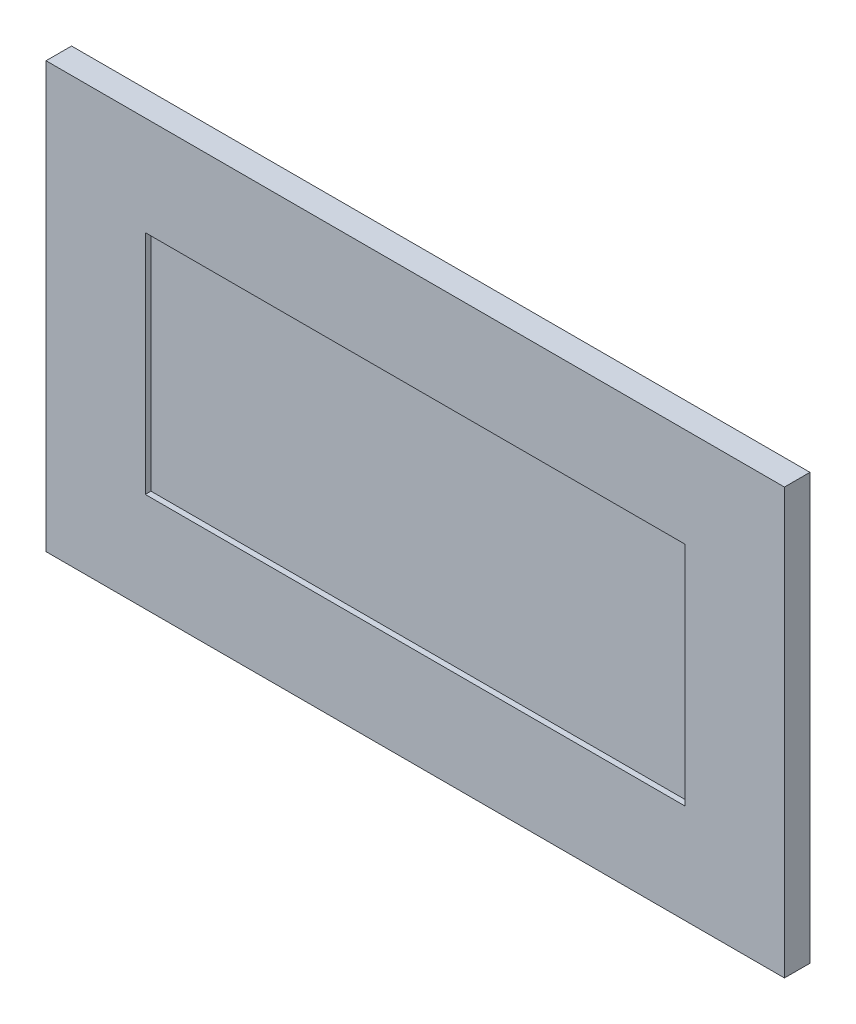
ISO-10303-21;
HEADER;
FILE_DESCRIPTION(('STEP AP214'),'2;1');
FILE_NAME('part.step','',(''),(''),'','','');
FILE_SCHEMA(('AUTOMOTIVE_DESIGN { 1 0 10303 214 1 1 1 1 }'));
ENDSEC;
DATA;
#1=APPLICATION_CONTEXT('core data for automotive mechanical design processes');
#2=APPLICATION_PROTOCOL_DEFINITION('international standard','automotive_design',2000,#1);
#3=PRODUCT_CONTEXT('',#1,'mechanical');
#4=PRODUCT('Part','Part','',(#3));
#5=PRODUCT_RELATED_PRODUCT_CATEGORY('part','',(#4));
#6=PRODUCT_DEFINITION_FORMATION('','',#4);
#7=PRODUCT_DEFINITION_CONTEXT('part definition',#1,'design');
#8=PRODUCT_DEFINITION('design','',#6,#7);
#9=PRODUCT_DEFINITION_SHAPE('','',#8);
#10=(LENGTH_UNIT() NAMED_UNIT(*) SI_UNIT(.MILLI.,.METRE.));
#11=(NAMED_UNIT(*) PLANE_ANGLE_UNIT() SI_UNIT($,.RADIAN.));
#12=(NAMED_UNIT(*) SI_UNIT($,.STERADIAN.) SOLID_ANGLE_UNIT());
#13=UNCERTAINTY_MEASURE_WITH_UNIT(LENGTH_MEASURE(1.E-05),#10,'distance_accuracy_value','');
#14=(GEOMETRIC_REPRESENTATION_CONTEXT(3) GLOBAL_UNCERTAINTY_ASSIGNED_CONTEXT((#13)) GLOBAL_UNIT_ASSIGNED_CONTEXT((#10,
#11,#12)) REPRESENTATION_CONTEXT('',''));
#15=CARTESIAN_POINT('',(0.,0.,0.));
#16=DIRECTION('',(0.,0.,1.));
#17=DIRECTION('',(1.,0.,0.));
#18=AXIS2_PLACEMENT_3D('',#15,#16,#17);
#19=CARTESIAN_POINT('',(260.5,150.,18.));
#20=DIRECTION('',(-1.,0.,0.));
#21=DIRECTION('',(0.,-1.,0.));
#22=AXIS2_PLACEMENT_3D('',#19,#20,#21);
#23=PLANE('',#22);
#24=DIRECTION('',(0.,1.,0.));
#25=VECTOR('',#24,1.);
#26=CARTESIAN_POINT('',(260.5,150.,0.));
#27=LINE('',#26,#25);
#28=CARTESIAN_POINT('',(260.5,-150.,0.));
#29=VERTEX_POINT('',#28);
#30=CARTESIAN_POINT('',(260.5,150.,0.));
#31=VERTEX_POINT('',#30);
#32=EDGE_CURVE('E141',#29,#31,#27,.T.);
#33=ORIENTED_EDGE('',*,*,#32,.T.);
#34=DIRECTION('',(0.,0.,-1.));
#35=VECTOR('',#34,1.);
#36=CARTESIAN_POINT('',(260.5,150.,18.));
#37=LINE('',#36,#35);
#38=CARTESIAN_POINT('',(260.5,150.,18.));
#39=VERTEX_POINT('',#38);
#40=EDGE_CURVE('E11',#39,#31,#37,.T.);
#41=ORIENTED_EDGE('',*,*,#40,.F.);
#42=DIRECTION('',(0.,1.,0.));
#43=VECTOR('',#42,1.);
#44=CARTESIAN_POINT('',(260.5,150.,18.));
#45=LINE('',#44,#43);
#46=CARTESIAN_POINT('',(260.5,-150.,18.));
#47=VERTEX_POINT('',#46);
#48=EDGE_CURVE('E145',#47,#39,#45,.T.);
#49=ORIENTED_EDGE('',*,*,#48,.F.);
#50=DIRECTION('',(0.,0.,-1.));
#51=VECTOR('',#50,1.);
#52=CARTESIAN_POINT('',(260.5,-150.,18.));
#53=LINE('',#52,#51);
#54=EDGE_CURVE('E151',#47,#29,#53,.T.);
#55=ORIENTED_EDGE('',*,*,#54,.T.);
#56=EDGE_LOOP('',(#33,#41,#49,#55));
#57=FACE_BOUND('',#56,.T.);
#58=ADVANCED_FACE('F33',(#57),#23,.F.);
#59=CARTESIAN_POINT('',(-260.5,150.,18.));
#60=DIRECTION('',(0.,-1.,0.));
#61=DIRECTION('',(0.,0.,-1.));
#62=AXIS2_PLACEMENT_3D('',#59,#60,#61);
#63=PLANE('',#62);
#64=DIRECTION('',(-1.,0.,0.));
#65=VECTOR('',#64,1.);
#66=CARTESIAN_POINT('',(-260.5,150.,0.));
#67=LINE('',#66,#65);
#68=CARTESIAN_POINT('',(-260.5,150.,0.));
#69=VERTEX_POINT('',#68);
#70=EDGE_CURVE('E154',#31,#69,#67,.T.);
#71=ORIENTED_EDGE('',*,*,#70,.T.);
#72=DIRECTION('',(0.,0.,-1.));
#73=VECTOR('',#72,1.);
#74=CARTESIAN_POINT('',(-260.5,150.,18.));
#75=LINE('',#74,#73);
#76=CARTESIAN_POINT('',(-260.5,150.,18.));
#77=VERTEX_POINT('',#76);
#78=EDGE_CURVE('E40',#77,#69,#75,.T.);
#79=ORIENTED_EDGE('',*,*,#78,.F.);
#80=DIRECTION('',(-1.,0.,0.));
#81=VECTOR('',#80,1.);
#82=CARTESIAN_POINT('',(-260.5,150.,18.));
#83=LINE('',#82,#81);
#84=EDGE_CURVE('E84',#39,#77,#83,.T.);
#85=ORIENTED_EDGE('',*,*,#84,.F.);
#86=ORIENTED_EDGE('',*,*,#40,.T.);
#87=EDGE_LOOP('',(#71,#79,#85,#86));
#88=FACE_BOUND('',#87,.T.);
#89=ADVANCED_FACE('F183',(#88),#63,.F.);
#90=CARTESIAN_POINT('',(-260.5,150.,18.));
#91=DIRECTION('',(1.,0.,0.));
#92=DIRECTION('',(0.,1.,0.));
#93=AXIS2_PLACEMENT_3D('',#90,#91,#92);
#94=PLANE('',#93);
#95=DIRECTION('',(0.,-1.,0.));
#96=VECTOR('',#95,1.);
#97=CARTESIAN_POINT('',(-260.5,150.,0.));
#98=LINE('',#97,#96);
#99=CARTESIAN_POINT('',(-260.5,-150.,0.));
#100=VERTEX_POINT('',#99);
#101=EDGE_CURVE('E156',#69,#100,#98,.T.);
#102=ORIENTED_EDGE('',*,*,#101,.T.);
#103=DIRECTION('',(0.,0.,-1.));
#104=VECTOR('',#103,1.);
#105=CARTESIAN_POINT('',(-260.5,-150.,18.));
#106=LINE('',#105,#104);
#107=CARTESIAN_POINT('',(-260.5,-150.,18.));
#108=VERTEX_POINT('',#107);
#109=EDGE_CURVE('E160',#108,#100,#106,.T.);
#110=ORIENTED_EDGE('',*,*,#109,.F.);
#111=DIRECTION('',(0.,-1.,0.));
#112=VECTOR('',#111,1.);
#113=CARTESIAN_POINT('',(-260.5,150.,18.));
#114=LINE('',#113,#112);
#115=EDGE_CURVE('E148',#77,#108,#114,.T.);
#116=ORIENTED_EDGE('',*,*,#115,.F.);
#117=ORIENTED_EDGE('',*,*,#78,.T.);
#118=EDGE_LOOP('',(#102,#110,#116,#117));
#119=FACE_BOUND('',#118,.T.);
#120=ADVANCED_FACE('F165',(#119),#94,.F.);
#121=CARTESIAN_POINT('',(-260.5,-150.,18.));
#122=DIRECTION('',(0.,1.,0.));
#123=DIRECTION('',(0.,0.,1.));
#124=AXIS2_PLACEMENT_3D('',#121,#122,#123);
#125=PLANE('',#124);
#126=DIRECTION('',(1.,0.,0.));
#127=VECTOR('',#126,1.);
#128=CARTESIAN_POINT('',(-260.5,-150.,0.));
#129=LINE('',#128,#127);
#130=EDGE_CURVE('E77',#100,#29,#129,.T.);
#131=ORIENTED_EDGE('',*,*,#130,.T.);
#132=ORIENTED_EDGE('',*,*,#54,.F.);
#133=DIRECTION('',(1.,0.,0.));
#134=VECTOR('',#133,1.);
#135=CARTESIAN_POINT('',(-260.5,-150.,18.));
#136=LINE('',#135,#134);
#137=EDGE_CURVE('E56',#108,#47,#136,.T.);
#138=ORIENTED_EDGE('',*,*,#137,.F.);
#139=ORIENTED_EDGE('',*,*,#109,.T.);
#140=EDGE_LOOP('',(#131,#132,#138,#139));
#141=FACE_BOUND('',#140,.T.);
#142=ADVANCED_FACE('F173',(#141),#125,.F.);
#143=CARTESIAN_POINT('',(0.,0.,18.));
#144=DIRECTION('',(0.,0.,1.));
#145=DIRECTION('',(1.,0.,0.));
#146=AXIS2_PLACEMENT_3D('',#143,#144,#145);
#147=PLANE('',#146);
#148=DIRECTION('',(0.,1.,0.));
#149=VECTOR('',#148,1.);
#150=CARTESIAN_POINT('',(190.5,79.9999999999999,18.));
#151=LINE('',#150,#149);
#152=CARTESIAN_POINT('',(190.5,-79.9999999999999,18.));
#153=VERTEX_POINT('',#152);
#154=CARTESIAN_POINT('',(190.5,79.9999999999999,18.));
#155=VERTEX_POINT('',#154);
#156=EDGE_CURVE('E47',#153,#155,#151,.T.);
#157=ORIENTED_EDGE('',*,*,#156,.F.);
#158=DIRECTION('',(1.,0.,0.));
#159=VECTOR('',#158,1.);
#160=CARTESIAN_POINT('',(-190.5,-79.9999999999999,18.));
#161=LINE('',#160,#159);
#162=CARTESIAN_POINT('',(-190.5,-79.9999999999999,18.));
#163=VERTEX_POINT('',#162);
#164=EDGE_CURVE('E126',#163,#153,#161,.T.);
#165=ORIENTED_EDGE('',*,*,#164,.F.);
#166=DIRECTION('',(0.,-1.,0.));
#167=VECTOR('',#166,1.);
#168=CARTESIAN_POINT('',(-190.5,79.9999999999999,18.));
#169=LINE('',#168,#167);
#170=CARTESIAN_POINT('',(-190.5,79.9999999999999,18.));
#171=VERTEX_POINT('',#170);
#172=EDGE_CURVE('E129',#171,#163,#169,.T.);
#173=ORIENTED_EDGE('',*,*,#172,.F.);
#174=DIRECTION('',(-1.,0.,0.));
#175=VECTOR('',#174,1.);
#176=CARTESIAN_POINT('',(-190.5,79.9999999999999,18.));
#177=LINE('',#176,#175);
#178=EDGE_CURVE('E135',#155,#171,#177,.T.);
#179=ORIENTED_EDGE('',*,*,#178,.F.);
#180=EDGE_LOOP('',(#157,#165,#173,#179));
#181=FACE_BOUND('',#180,.T.);
#182=ORIENTED_EDGE('',*,*,#48,.T.);
#183=ORIENTED_EDGE('',*,*,#84,.T.);
#184=ORIENTED_EDGE('',*,*,#115,.T.);
#185=ORIENTED_EDGE('',*,*,#137,.T.);
#186=EDGE_LOOP('',(#182,#183,#184,#185));
#187=FACE_BOUND('',#186,.T.);
#188=ADVANCED_FACE('F175',(#181,#187),#147,.T.);
#189=CARTESIAN_POINT('',(0.,0.,0.));
#190=DIRECTION('',(0.,0.,1.));
#191=DIRECTION('',(1.,0.,0.));
#192=AXIS2_PLACEMENT_3D('',#189,#190,#191);
#193=PLANE('',#192);
#194=ORIENTED_EDGE('',*,*,#32,.F.);
#195=ORIENTED_EDGE('',*,*,#130,.F.);
#196=ORIENTED_EDGE('',*,*,#101,.F.);
#197=ORIENTED_EDGE('',*,*,#70,.F.);
#198=EDGE_LOOP('',(#194,#195,#196,#197));
#199=FACE_BOUND('',#198,.T.);
#200=ADVANCED_FACE('F169',(#199),#193,.F.);
#201=CARTESIAN_POINT('',(190.5,79.9999999999999,14.));
#202=DIRECTION('',(1.,0.,0.));
#203=DIRECTION('',(0.,0.,-1.));
#204=AXIS2_PLACEMENT_3D('',#201,#202,#203);
#205=PLANE('',#204);
#206=ORIENTED_EDGE('',*,*,#156,.T.);
#207=DIRECTION('',(0.,0.,1.));
#208=VECTOR('',#207,1.);
#209=CARTESIAN_POINT('',(190.5,79.9999999999999,14.));
#210=LINE('',#209,#208);
#211=CARTESIAN_POINT('',(190.5,79.9999999999999,14.));
#212=VERTEX_POINT('',#211);
#213=EDGE_CURVE('E104',#212,#155,#210,.T.);
#214=ORIENTED_EDGE('',*,*,#213,.F.);
#215=DIRECTION('',(0.,1.,0.));
#216=VECTOR('',#215,1.);
#217=CARTESIAN_POINT('',(190.5,79.9999999999999,14.));
#218=LINE('',#217,#216);
#219=CARTESIAN_POINT('',(190.5,-79.9999999999999,14.));
#220=VERTEX_POINT('',#219);
#221=EDGE_CURVE('E108',#220,#212,#218,.T.);
#222=ORIENTED_EDGE('',*,*,#221,.F.);
#223=DIRECTION('',(0.,0.,1.));
#224=VECTOR('',#223,1.);
#225=CARTESIAN_POINT('',(190.5,-79.9999999999999,14.));
#226=LINE('',#225,#224);
#227=EDGE_CURVE('E139',#220,#153,#226,.T.);
#228=ORIENTED_EDGE('',*,*,#227,.T.);
#229=EDGE_LOOP('',(#206,#214,#222,#228));
#230=FACE_BOUND('',#229,.T.);
#231=ADVANCED_FACE('F106',(#230),#205,.F.);
#232=CARTESIAN_POINT('',(-190.5,-79.9999999999999,14.));
#233=DIRECTION('',(0.,-1.,0.));
#234=DIRECTION('',(0.,0.,-1.));
#235=AXIS2_PLACEMENT_3D('',#232,#233,#234);
#236=PLANE('',#235);
#237=ORIENTED_EDGE('',*,*,#164,.T.);
#238=ORIENTED_EDGE('',*,*,#227,.F.);
#239=DIRECTION('',(1.,0.,0.));
#240=VECTOR('',#239,1.);
#241=CARTESIAN_POINT('',(-190.5,-79.9999999999999,14.));
#242=LINE('',#241,#240);
#243=CARTESIAN_POINT('',(-190.5,-79.9999999999999,14.));
#244=VERTEX_POINT('',#243);
#245=EDGE_CURVE('E114',#244,#220,#242,.T.);
#246=ORIENTED_EDGE('',*,*,#245,.F.);
#247=DIRECTION('',(0.,0.,1.));
#248=VECTOR('',#247,1.);
#249=CARTESIAN_POINT('',(-190.5,-79.9999999999999,14.));
#250=LINE('',#249,#248);
#251=EDGE_CURVE('E142',#244,#163,#250,.T.);
#252=ORIENTED_EDGE('',*,*,#251,.T.);
#253=EDGE_LOOP('',(#237,#238,#246,#252));
#254=FACE_BOUND('',#253,.T.);
#255=ADVANCED_FACE('F222',(#254),#236,.F.);
#256=CARTESIAN_POINT('',(-190.5,79.9999999999999,14.));
#257=DIRECTION('',(-1.,0.,0.));
#258=DIRECTION('',(0.,0.,1.));
#259=AXIS2_PLACEMENT_3D('',#256,#257,#258);
#260=PLANE('',#259);
#261=ORIENTED_EDGE('',*,*,#172,.T.);
#262=ORIENTED_EDGE('',*,*,#251,.F.);
#263=DIRECTION('',(0.,-1.,0.));
#264=VECTOR('',#263,1.);
#265=CARTESIAN_POINT('',(-190.5,79.9999999999999,14.));
#266=LINE('',#265,#264);
#267=CARTESIAN_POINT('',(-190.5,79.9999999999999,14.));
#268=VERTEX_POINT('',#267);
#269=EDGE_CURVE('E122',#268,#244,#266,.T.);
#270=ORIENTED_EDGE('',*,*,#269,.F.);
#271=DIRECTION('',(0.,0.,1.));
#272=VECTOR('',#271,1.);
#273=CARTESIAN_POINT('',(-190.5,79.9999999999999,14.));
#274=LINE('',#273,#272);
#275=EDGE_CURVE('E113',#268,#171,#274,.T.);
#276=ORIENTED_EDGE('',*,*,#275,.T.);
#277=EDGE_LOOP('',(#261,#262,#270,#276));
#278=FACE_BOUND('',#277,.T.);
#279=ADVANCED_FACE('F231',(#278),#260,.F.);
#280=CARTESIAN_POINT('',(-190.5,79.9999999999999,14.));
#281=DIRECTION('',(0.,1.,0.));
#282=DIRECTION('',(0.,0.,1.));
#283=AXIS2_PLACEMENT_3D('',#280,#281,#282);
#284=PLANE('',#283);
#285=ORIENTED_EDGE('',*,*,#178,.T.);
#286=ORIENTED_EDGE('',*,*,#275,.F.);
#287=DIRECTION('',(-1.,0.,0.));
#288=VECTOR('',#287,1.);
#289=CARTESIAN_POINT('',(-190.5,79.9999999999999,14.));
#290=LINE('',#289,#288);
#291=EDGE_CURVE('E117',#212,#268,#290,.T.);
#292=ORIENTED_EDGE('',*,*,#291,.F.);
#293=ORIENTED_EDGE('',*,*,#213,.T.);
#294=EDGE_LOOP('',(#285,#286,#292,#293));
#295=FACE_BOUND('',#294,.T.);
#296=ADVANCED_FACE('F118',(#295),#284,.F.);
#297=CARTESIAN_POINT('',(0.,0.,14.));
#298=DIRECTION('',(0.,0.,1.));
#299=DIRECTION('',(1.,0.,0.));
#300=AXIS2_PLACEMENT_3D('',#297,#298,#299);
#301=PLANE('',#300);
#302=ORIENTED_EDGE('',*,*,#221,.T.);
#303=ORIENTED_EDGE('',*,*,#291,.T.);
#304=ORIENTED_EDGE('',*,*,#269,.T.);
#305=ORIENTED_EDGE('',*,*,#245,.T.);
#306=EDGE_LOOP('',(#302,#303,#304,#305));
#307=FACE_BOUND('',#306,.T.);
#308=ADVANCED_FACE('F124',(#307),#301,.T.);
#309=CLOSED_SHELL('',(#58,#89,#120,#142,#188,#200,#231,#255,#279,#296,#308));
#310=MANIFOLD_SOLID_BREP('B2',#309);
#311=ADVANCED_BREP_SHAPE_REPRESENTATION('',(#18,#310),#14);
#312=SHAPE_DEFINITION_REPRESENTATION(#9,#311);
ENDSEC;
END-ISO-10303-21;
